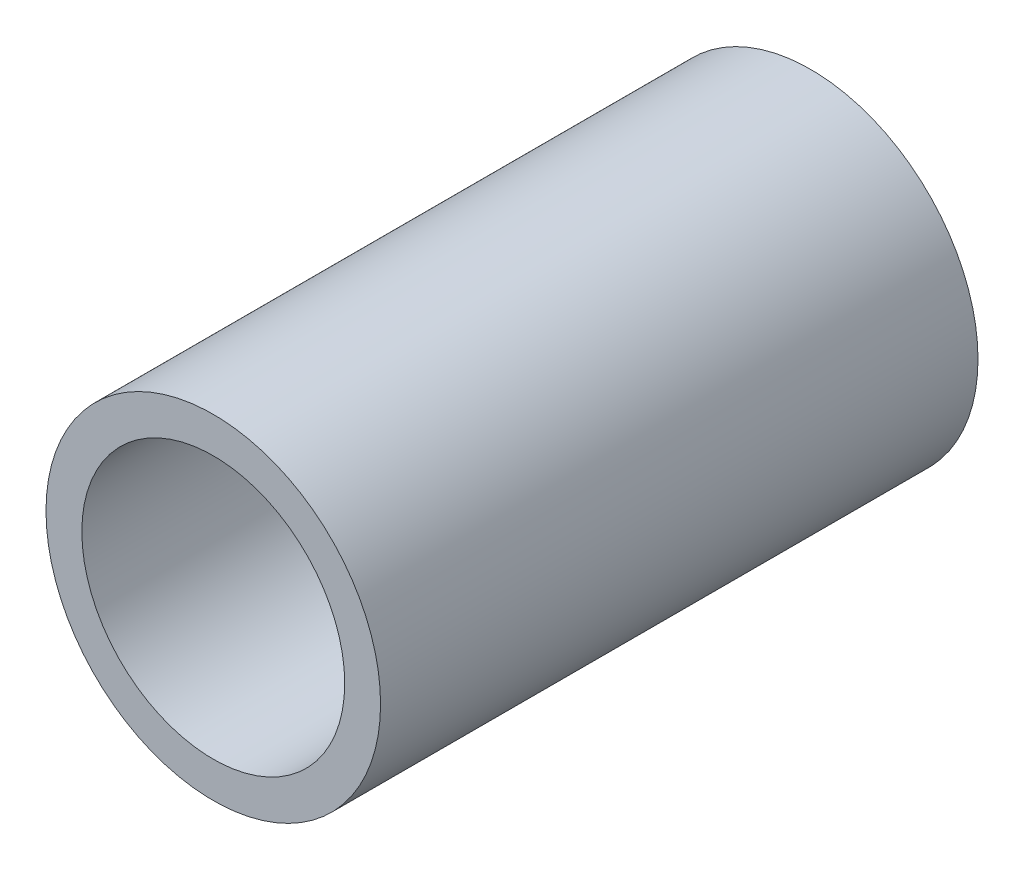
ISO-10303-21;
HEADER;
FILE_DESCRIPTION(('STEP AP214'),'2;1');
FILE_NAME('part.step','',(''),(''),'','','');
FILE_SCHEMA(('AUTOMOTIVE_DESIGN { 1 0 10303 214 1 1 1 1 }'));
ENDSEC;
DATA;
#1=APPLICATION_CONTEXT('core data for automotive mechanical design processes');
#2=APPLICATION_PROTOCOL_DEFINITION('international standard','automotive_design',2000,#1);
#3=PRODUCT_CONTEXT('',#1,'mechanical');
#4=PRODUCT('Part','Part','',(#3));
#5=PRODUCT_RELATED_PRODUCT_CATEGORY('part','',(#4));
#6=PRODUCT_DEFINITION_FORMATION('','',#4);
#7=PRODUCT_DEFINITION_CONTEXT('part definition',#1,'design');
#8=PRODUCT_DEFINITION('design','',#6,#7);
#9=PRODUCT_DEFINITION_SHAPE('','',#8);
#10=(LENGTH_UNIT() NAMED_UNIT(*) SI_UNIT(.MILLI.,.METRE.));
#11=(NAMED_UNIT(*) PLANE_ANGLE_UNIT() SI_UNIT($,.RADIAN.));
#12=(NAMED_UNIT(*) SI_UNIT($,.STERADIAN.) SOLID_ANGLE_UNIT());
#13=UNCERTAINTY_MEASURE_WITH_UNIT(LENGTH_MEASURE(1.E-05),#10,'distance_accuracy_value','');
#14=(GEOMETRIC_REPRESENTATION_CONTEXT(3) GLOBAL_UNCERTAINTY_ASSIGNED_CONTEXT((#13)) GLOBAL_UNIT_ASSIGNED_CONTEXT((#10,
#11,#12)) REPRESENTATION_CONTEXT('',''));
#15=CARTESIAN_POINT('',(0.,0.,0.));
#16=DIRECTION('',(0.,0.,1.));
#17=DIRECTION('',(1.,0.,0.));
#18=AXIS2_PLACEMENT_3D('',#15,#16,#17);
#19=CARTESIAN_POINT('',(2.25364909633613,0.,50.));
#20=DIRECTION('',(0.,0.,1.));
#21=DIRECTION('',(1.,0.,0.));
#22=AXIS2_PLACEMENT_3D('',#19,#20,#21);
#23=PLANE('',#22);
#24=CARTESIAN_POINT('',(2.25364909633613,0.,50.));
#25=DIRECTION('',(0.,0.,1.));
#26=DIRECTION('',(1.,0.,0.));
#27=AXIS2_PLACEMENT_3D('',#24,#25,#26);
#28=CIRCLE('',#27,14.);
#29=CARTESIAN_POINT('',(16.2536490963361,0.,50.));
#30=VERTEX_POINT('',#29);
#31=EDGE_CURVE('E10',#30,#30,#28,.T.);
#32=ORIENTED_EDGE('',*,*,#31,.T.);
#33=EDGE_LOOP('',(#32));
#34=FACE_BOUND('',#33,.T.);
#35=CARTESIAN_POINT('',(2.25364909633613,0.,50.));
#36=DIRECTION('',(0.,0.,1.));
#37=DIRECTION('',(1.,0.,0.));
#38=AXIS2_PLACEMENT_3D('',#35,#36,#37);
#39=CIRCLE('',#38,11.);
#40=CARTESIAN_POINT('',(13.2536490963361,0.,50.));
#41=VERTEX_POINT('',#40);
#42=EDGE_CURVE('E42',#41,#41,#39,.T.);
#43=ORIENTED_EDGE('',*,*,#42,.F.);
#44=EDGE_LOOP('',(#43));
#45=FACE_BOUND('',#44,.T.);
#46=ADVANCED_FACE('F31',(#34,#45),#23,.T.);
#47=CARTESIAN_POINT('',(2.25364909633613,0.,0.));
#48=DIRECTION('',(0.,0.,1.));
#49=DIRECTION('',(1.,0.,0.));
#50=AXIS2_PLACEMENT_3D('',#47,#48,#49);
#51=PLANE('',#50);
#52=CARTESIAN_POINT('',(2.25364909633613,0.,0.));
#53=DIRECTION('',(0.,0.,1.));
#54=DIRECTION('',(1.,0.,0.));
#55=AXIS2_PLACEMENT_3D('',#52,#53,#54);
#56=CIRCLE('',#55,14.);
#57=CARTESIAN_POINT('',(16.2536490963361,0.,0.));
#58=VERTEX_POINT('',#57);
#59=EDGE_CURVE('E35',#58,#58,#56,.T.);
#60=ORIENTED_EDGE('',*,*,#59,.F.);
#61=EDGE_LOOP('',(#60));
#62=FACE_BOUND('',#61,.T.);
#63=CARTESIAN_POINT('',(2.25364909633613,0.,0.));
#64=DIRECTION('',(0.,0.,1.));
#65=DIRECTION('',(1.,0.,0.));
#66=AXIS2_PLACEMENT_3D('',#63,#64,#65);
#67=CIRCLE('',#66,11.);
#68=CARTESIAN_POINT('',(13.2536490963361,0.,0.));
#69=VERTEX_POINT('',#68);
#70=EDGE_CURVE('E44',#69,#69,#67,.T.);
#71=ORIENTED_EDGE('',*,*,#70,.T.);
#72=EDGE_LOOP('',(#71));
#73=FACE_BOUND('',#72,.T.);
#74=ADVANCED_FACE('F54',(#62,#73),#51,.F.);
#75=CARTESIAN_POINT('',(2.25364909633613,0.,50.));
#76=DIRECTION('',(0.,0.,-1.));
#77=DIRECTION('',(-1.,0.,0.));
#78=AXIS2_PLACEMENT_3D('',#75,#76,#77);
#79=CYLINDRICAL_SURFACE('',#78,14.);
#80=ORIENTED_EDGE('',*,*,#31,.F.);
#81=EDGE_LOOP('',(#80));
#82=FACE_BOUND('',#81,.T.);
#83=ORIENTED_EDGE('',*,*,#59,.T.);
#84=EDGE_LOOP('',(#83));
#85=FACE_BOUND('',#84,.T.);
#86=ADVANCED_FACE('F33',(#82,#85),#79,.T.);
#87=CARTESIAN_POINT('',(2.25364909633613,0.,50.));
#88=DIRECTION('',(0.,0.,-1.));
#89=DIRECTION('',(-1.,0.,0.));
#90=AXIS2_PLACEMENT_3D('',#87,#88,#89);
#91=CYLINDRICAL_SURFACE('',#90,11.);
#92=ORIENTED_EDGE('',*,*,#42,.T.);
#93=EDGE_LOOP('',(#92));
#94=FACE_BOUND('',#93,.T.);
#95=ORIENTED_EDGE('',*,*,#70,.F.);
#96=EDGE_LOOP('',(#95));
#97=FACE_BOUND('',#96,.T.);
#98=ADVANCED_FACE('F50',(#94,#97),#91,.F.);
#99=CLOSED_SHELL('',(#46,#74,#86,#98));
#100=MANIFOLD_SOLID_BREP('B2',#99);
#101=ADVANCED_BREP_SHAPE_REPRESENTATION('',(#18,#100),#14);
#102=SHAPE_DEFINITION_REPRESENTATION(#9,#101);
ENDSEC;
END-ISO-10303-21;
